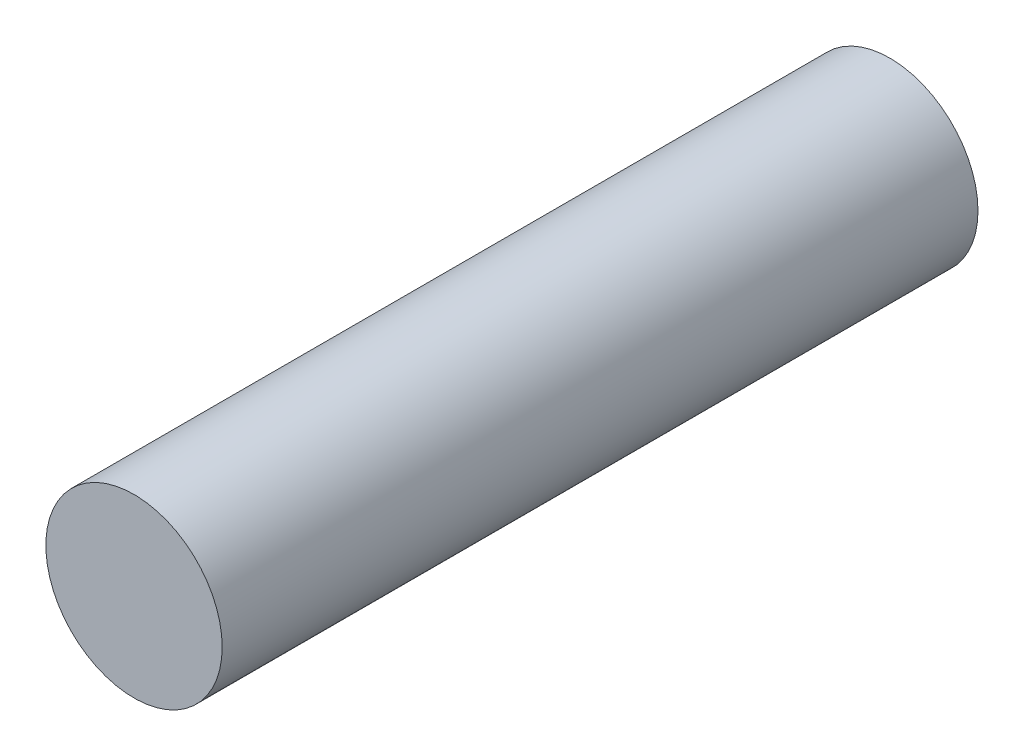
ISO-10303-21;
HEADER;
FILE_DESCRIPTION(('STEP AP214'),'2;1');
FILE_NAME('part.step','',(''),(''),'','','');
FILE_SCHEMA(('AUTOMOTIVE_DESIGN { 1 0 10303 214 1 1 1 1 }'));
ENDSEC;
DATA;
#1=APPLICATION_CONTEXT('core data for automotive mechanical design processes');
#2=APPLICATION_PROTOCOL_DEFINITION('international standard','automotive_design',2000,#1);
#3=PRODUCT_CONTEXT('',#1,'mechanical');
#4=PRODUCT('Part','Part','',(#3));
#5=PRODUCT_RELATED_PRODUCT_CATEGORY('part','',(#4));
#6=PRODUCT_DEFINITION_FORMATION('','',#4);
#7=PRODUCT_DEFINITION_CONTEXT('part definition',#1,'design');
#8=PRODUCT_DEFINITION('design','',#6,#7);
#9=PRODUCT_DEFINITION_SHAPE('','',#8);
#10=(LENGTH_UNIT() NAMED_UNIT(*) SI_UNIT(.MILLI.,.METRE.));
#11=(NAMED_UNIT(*) PLANE_ANGLE_UNIT() SI_UNIT($,.RADIAN.));
#12=(NAMED_UNIT(*) SI_UNIT($,.STERADIAN.) SOLID_ANGLE_UNIT());
#13=UNCERTAINTY_MEASURE_WITH_UNIT(LENGTH_MEASURE(1.E-05),#10,'distance_accuracy_value','');
#14=(GEOMETRIC_REPRESENTATION_CONTEXT(3) GLOBAL_UNCERTAINTY_ASSIGNED_CONTEXT((#13)) GLOBAL_UNIT_ASSIGNED_CONTEXT((#10,
#11,#12)) REPRESENTATION_CONTEXT('',''));
#15=CARTESIAN_POINT('',(0.,0.,0.));
#16=DIRECTION('',(0.,0.,1.));
#17=DIRECTION('',(1.,0.,0.));
#18=AXIS2_PLACEMENT_3D('',#15,#16,#17);
#19=CARTESIAN_POINT('',(0.,0.,6.));
#20=DIRECTION('',(0.,0.,-1.));
#21=DIRECTION('',(-1.,0.,0.));
#22=AXIS2_PLACEMENT_3D('',#19,#20,#21);
#23=CYLINDRICAL_SURFACE('',#22,0.699999999999999);
#24=CARTESIAN_POINT('',(0.,0.,6.));
#25=DIRECTION('',(0.,0.,1.));
#26=DIRECTION('',(1.,0.,0.));
#27=AXIS2_PLACEMENT_3D('',#24,#25,#26);
#28=CIRCLE('',#27,0.699999999999999);
#29=CARTESIAN_POINT('',(0.699999999999999,0.,6.));
#30=VERTEX_POINT('',#29);
#31=EDGE_CURVE('E10',#30,#30,#28,.T.);
#32=ORIENTED_EDGE('',*,*,#31,.F.);
#33=EDGE_LOOP('',(#32));
#34=FACE_BOUND('',#33,.T.);
#35=CARTESIAN_POINT('',(0.,0.,0.));
#36=DIRECTION('',(0.,0.,1.));
#37=DIRECTION('',(1.,0.,0.));
#38=AXIS2_PLACEMENT_3D('',#35,#36,#37);
#39=CIRCLE('',#38,0.699999999999999);
#40=CARTESIAN_POINT('',(0.699999999999999,0.,0.));
#41=VERTEX_POINT('',#40);
#42=EDGE_CURVE('E45',#41,#41,#39,.T.);
#43=ORIENTED_EDGE('',*,*,#42,.T.);
#44=EDGE_LOOP('',(#43));
#45=FACE_BOUND('',#44,.T.);
#46=ADVANCED_FACE('F39',(#34,#45),#23,.T.);
#47=CARTESIAN_POINT('',(0.,0.,6.));
#48=DIRECTION('',(0.,0.,1.));
#49=DIRECTION('',(1.,0.,0.));
#50=AXIS2_PLACEMENT_3D('',#47,#48,#49);
#51=PLANE('',#50);
#52=ORIENTED_EDGE('',*,*,#31,.T.);
#53=EDGE_LOOP('',(#52));
#54=FACE_BOUND('',#53,.T.);
#55=ADVANCED_FACE('F53',(#54),#51,.T.);
#56=CARTESIAN_POINT('',(0.,0.,0.));
#57=DIRECTION('',(0.,0.,1.));
#58=DIRECTION('',(1.,0.,0.));
#59=AXIS2_PLACEMENT_3D('',#56,#57,#58);
#60=PLANE('',#59);
#61=ORIENTED_EDGE('',*,*,#42,.F.);
#62=EDGE_LOOP('',(#61));
#63=FACE_BOUND('',#62,.T.);
#64=ADVANCED_FACE('F55',(#63),#60,.F.);
#65=CLOSED_SHELL('',(#46,#55,#64));
#66=MANIFOLD_SOLID_BREP('B2',#65);
#67=ADVANCED_BREP_SHAPE_REPRESENTATION('',(#18,#66),#14);
#68=SHAPE_DEFINITION_REPRESENTATION(#9,#67);
ENDSEC;
END-ISO-10303-21;
